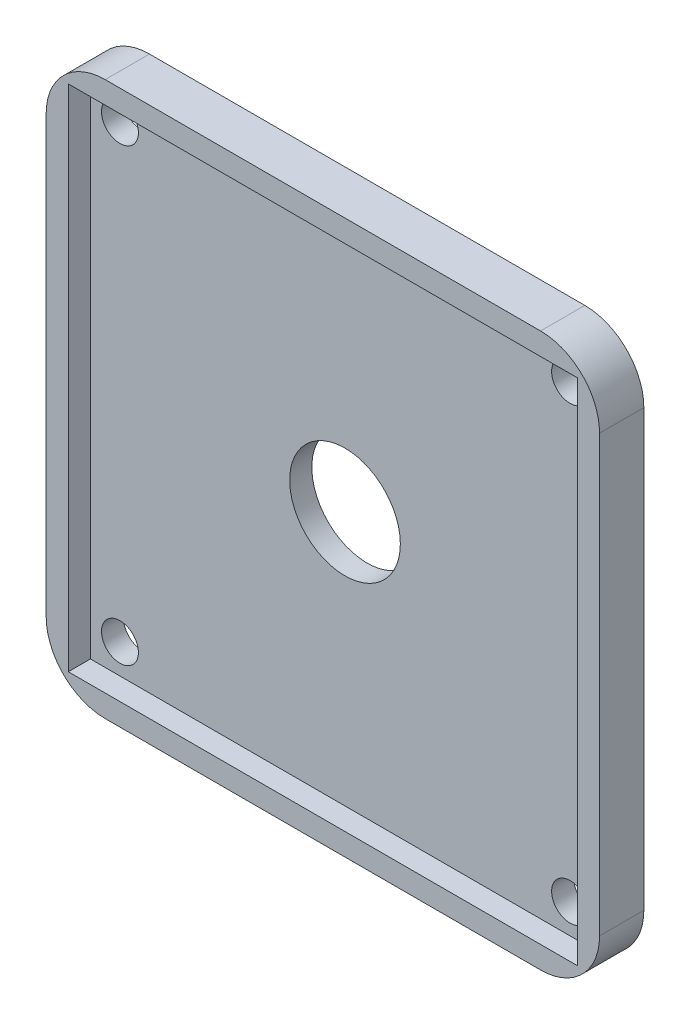
ISO-10303-21;
HEADER;
FILE_DESCRIPTION(('STEP AP214'),'2;1');
FILE_NAME('part.step','',(''),(''),'','','');
FILE_SCHEMA(('AUTOMOTIVE_DESIGN { 1 0 10303 214 1 1 1 1 }'));
ENDSEC;
DATA;
#1=APPLICATION_CONTEXT('core data for automotive mechanical design processes');
#2=APPLICATION_PROTOCOL_DEFINITION('international standard','automotive_design',2000,#1);
#3=PRODUCT_CONTEXT('',#1,'mechanical');
#4=PRODUCT('Part','Part','',(#3));
#5=PRODUCT_RELATED_PRODUCT_CATEGORY('part','',(#4));
#6=PRODUCT_DEFINITION_FORMATION('','',#4);
#7=PRODUCT_DEFINITION_CONTEXT('part definition',#1,'design');
#8=PRODUCT_DEFINITION('design','',#6,#7);
#9=PRODUCT_DEFINITION_SHAPE('','',#8);
#10=(LENGTH_UNIT() NAMED_UNIT(*) SI_UNIT(.MILLI.,.METRE.));
#11=(NAMED_UNIT(*) PLANE_ANGLE_UNIT() SI_UNIT($,.RADIAN.));
#12=(NAMED_UNIT(*) SI_UNIT($,.STERADIAN.) SOLID_ANGLE_UNIT());
#13=UNCERTAINTY_MEASURE_WITH_UNIT(LENGTH_MEASURE(1.E-05),#10,'distance_accuracy_value','');
#14=(GEOMETRIC_REPRESENTATION_CONTEXT(3) GLOBAL_UNCERTAINTY_ASSIGNED_CONTEXT((#13)) GLOBAL_UNIT_ASSIGNED_CONTEXT((#10,
#11,#12)) REPRESENTATION_CONTEXT('',''));
#15=CARTESIAN_POINT('',(0.,0.,0.));
#16=DIRECTION('',(0.,0.,1.));
#17=DIRECTION('',(1.,0.,0.));
#18=AXIS2_PLACEMENT_3D('',#15,#16,#17);
#19=CARTESIAN_POINT('',(7.00000000000001,68.,6.));
#20=DIRECTION('',(0.,0.,-1.));
#21=DIRECTION('',(-1.,0.,0.));
#22=AXIS2_PLACEMENT_3D('',#19,#20,#21);
#23=CYLINDRICAL_SURFACE('',#22,2.5);
#24=CARTESIAN_POINT('',(7.00000000000001,68.,0.));
#25=DIRECTION('',(0.,0.,1.));
#26=DIRECTION('',(1.,0.,0.));
#27=AXIS2_PLACEMENT_3D('',#24,#25,#26);
#28=CIRCLE('',#27,2.5);
#29=CARTESIAN_POINT('',(9.50000000000001,68.,0.));
#30=VERTEX_POINT('',#29);
#31=EDGE_CURVE('E216',#30,#30,#28,.T.);
#32=ORIENTED_EDGE('',*,*,#31,.F.);
#33=EDGE_LOOP('',(#32));
#34=FACE_BOUND('',#33,.T.);
#35=CARTESIAN_POINT('',(7.00000000000001,68.,3.));
#36=DIRECTION('',(0.,0.,1.));
#37=DIRECTION('',(1.,0.,0.));
#38=AXIS2_PLACEMENT_3D('',#35,#36,#37);
#39=CIRCLE('',#38,2.5);
#40=CARTESIAN_POINT('',(9.50000000000001,68.,3.));
#41=VERTEX_POINT('',#40);
#42=EDGE_CURVE('E196',#41,#41,#39,.T.);
#43=ORIENTED_EDGE('',*,*,#42,.T.);
#44=EDGE_LOOP('',(#43));
#45=FACE_BOUND('',#44,.T.);
#46=ADVANCED_FACE('F38',(#34,#45),#23,.F.);
#47=CARTESIAN_POINT('',(68.,68.,6.));
#48=DIRECTION('',(0.,0.,-1.));
#49=DIRECTION('',(-1.,0.,0.));
#50=AXIS2_PLACEMENT_3D('',#47,#48,#49);
#51=CYLINDRICAL_SURFACE('',#50,2.50000000000001);
#52=CARTESIAN_POINT('',(68.,68.,0.));
#53=DIRECTION('',(0.,0.,1.));
#54=DIRECTION('',(-1.,0.,0.));
#55=AXIS2_PLACEMENT_3D('',#52,#53,#54);
#56=CIRCLE('',#55,2.50000000000001);
#57=CARTESIAN_POINT('',(65.5,68.,0.));
#58=VERTEX_POINT('',#57);
#59=EDGE_CURVE('E212',#58,#58,#56,.T.);
#60=ORIENTED_EDGE('',*,*,#59,.F.);
#61=EDGE_LOOP('',(#60));
#62=FACE_BOUND('',#61,.T.);
#63=CARTESIAN_POINT('',(68.,68.,3.));
#64=DIRECTION('',(0.,0.,1.));
#65=DIRECTION('',(1.,0.,0.));
#66=AXIS2_PLACEMENT_3D('',#63,#64,#65);
#67=CIRCLE('',#66,2.50000000000001);
#68=CARTESIAN_POINT('',(70.5,68.,3.));
#69=VERTEX_POINT('',#68);
#70=EDGE_CURVE('E192',#69,#69,#67,.T.);
#71=ORIENTED_EDGE('',*,*,#70,.T.);
#72=EDGE_LOOP('',(#71));
#73=FACE_BOUND('',#72,.T.);
#74=ADVANCED_FACE('F339',(#62,#73),#51,.F.);
#75=CARTESIAN_POINT('',(68.,7.00000000000001,6.));
#76=DIRECTION('',(0.,0.,-1.));
#77=DIRECTION('',(-1.,0.,0.));
#78=AXIS2_PLACEMENT_3D('',#75,#76,#77);
#79=CYLINDRICAL_SURFACE('',#78,2.50000000000001);
#80=CARTESIAN_POINT('',(68.,7.00000000000001,0.));
#81=DIRECTION('',(0.,0.,1.));
#82=DIRECTION('',(1.,0.,0.));
#83=AXIS2_PLACEMENT_3D('',#80,#81,#82);
#84=CIRCLE('',#83,2.50000000000001);
#85=CARTESIAN_POINT('',(70.5,7.00000000000001,0.));
#86=VERTEX_POINT('',#85);
#87=EDGE_CURVE('E208',#86,#86,#84,.T.);
#88=ORIENTED_EDGE('',*,*,#87,.F.);
#89=EDGE_LOOP('',(#88));
#90=FACE_BOUND('',#89,.T.);
#91=CARTESIAN_POINT('',(68.,7.00000000000001,3.));
#92=DIRECTION('',(0.,0.,1.));
#93=DIRECTION('',(1.,0.,0.));
#94=AXIS2_PLACEMENT_3D('',#91,#92,#93);
#95=CIRCLE('',#94,2.50000000000001);
#96=CARTESIAN_POINT('',(70.5,7.00000000000001,3.));
#97=VERTEX_POINT('',#96);
#98=EDGE_CURVE('E188',#97,#97,#95,.T.);
#99=ORIENTED_EDGE('',*,*,#98,.T.);
#100=EDGE_LOOP('',(#99));
#101=FACE_BOUND('',#100,.T.);
#102=ADVANCED_FACE('F345',(#90,#101),#79,.F.);
#103=CARTESIAN_POINT('',(7.00000000000001,7.00000000000001,6.));
#104=DIRECTION('',(0.,0.,-1.));
#105=DIRECTION('',(-1.,0.,0.));
#106=AXIS2_PLACEMENT_3D('',#103,#104,#105);
#107=CYLINDRICAL_SURFACE('',#106,2.5);
#108=CARTESIAN_POINT('',(7.00000000000001,7.00000000000001,0.));
#109=DIRECTION('',(0.,0.,1.));
#110=DIRECTION('',(-1.,0.,0.));
#111=AXIS2_PLACEMENT_3D('',#108,#109,#110);
#112=CIRCLE('',#111,2.5);
#113=CARTESIAN_POINT('',(4.50000000000001,7.00000000000001,0.));
#114=VERTEX_POINT('',#113);
#115=EDGE_CURVE('E204',#114,#114,#112,.T.);
#116=ORIENTED_EDGE('',*,*,#115,.F.);
#117=EDGE_LOOP('',(#116));
#118=FACE_BOUND('',#117,.T.);
#119=CARTESIAN_POINT('',(7.00000000000001,7.00000000000001,3.));
#120=DIRECTION('',(0.,0.,1.));
#121=DIRECTION('',(1.,0.,0.));
#122=AXIS2_PLACEMENT_3D('',#119,#120,#121);
#123=CIRCLE('',#122,2.5);
#124=CARTESIAN_POINT('',(9.50000000000001,7.00000000000001,3.));
#125=VERTEX_POINT('',#124);
#126=EDGE_CURVE('E184',#125,#125,#123,.T.);
#127=ORIENTED_EDGE('',*,*,#126,.T.);
#128=EDGE_LOOP('',(#127));
#129=FACE_BOUND('',#128,.T.);
#130=ADVANCED_FACE('F450',(#118,#129),#107,.F.);
#131=CARTESIAN_POINT('',(37.5,37.5,6.));
#132=DIRECTION('',(0.,0.,-1.));
#133=DIRECTION('',(-1.,0.,0.));
#134=AXIS2_PLACEMENT_3D('',#131,#132,#133);
#135=CYLINDRICAL_SURFACE('',#134,7.5);
#136=CARTESIAN_POINT('',(37.5,37.5,0.));
#137=DIRECTION('',(0.,0.,1.));
#138=DIRECTION('',(1.,0.,0.));
#139=AXIS2_PLACEMENT_3D('',#136,#137,#138);
#140=CIRCLE('',#139,7.5);
#141=CARTESIAN_POINT('',(45.,37.5,0.));
#142=VERTEX_POINT('',#141);
#143=EDGE_CURVE('E200',#142,#142,#140,.T.);
#144=ORIENTED_EDGE('',*,*,#143,.F.);
#145=EDGE_LOOP('',(#144));
#146=FACE_BOUND('',#145,.T.);
#147=CARTESIAN_POINT('',(37.5,37.5,3.));
#148=DIRECTION('',(0.,0.,1.));
#149=DIRECTION('',(1.,0.,0.));
#150=AXIS2_PLACEMENT_3D('',#147,#148,#149);
#151=CIRCLE('',#150,7.5);
#152=CARTESIAN_POINT('',(45.,37.5,3.));
#153=VERTEX_POINT('',#152);
#154=EDGE_CURVE('E178',#153,#153,#151,.T.);
#155=ORIENTED_EDGE('',*,*,#154,.T.);
#156=EDGE_LOOP('',(#155));
#157=FACE_BOUND('',#156,.T.);
#158=ADVANCED_FACE('F354',(#146,#157),#135,.F.);
#159=CARTESIAN_POINT('',(0.,0.,6.));
#160=DIRECTION('',(0.,0.,-1.));
#161=DIRECTION('',(-1.,0.,0.));
#162=AXIS2_PLACEMENT_3D('',#159,#160,#161);
#163=PLANE('',#162);
#164=DIRECTION('',(1.,0.,0.));
#165=VECTOR('',#164,1.);
#166=CARTESIAN_POINT('',(3.00000000000001,3.,6.));
#167=LINE('',#166,#165);
#168=CARTESIAN_POINT('',(3.00000000000001,3.,6.));
#169=VERTEX_POINT('',#168);
#170=CARTESIAN_POINT('',(72.,3.,6.));
#171=VERTEX_POINT('',#170);
#172=EDGE_CURVE('E169',#169,#171,#167,.T.);
#173=ORIENTED_EDGE('',*,*,#172,.F.);
#174=DIRECTION('',(0.,-1.,0.));
#175=VECTOR('',#174,1.);
#176=CARTESIAN_POINT('',(3.,72.,6.));
#177=LINE('',#176,#175);
#178=CARTESIAN_POINT('',(3.,72.,6.));
#179=VERTEX_POINT('',#178);
#180=EDGE_CURVE('E136',#179,#169,#177,.T.);
#181=ORIENTED_EDGE('',*,*,#180,.F.);
#182=DIRECTION('',(-1.,0.,0.));
#183=VECTOR('',#182,1.);
#184=CARTESIAN_POINT('',(3.,72.,6.));
#185=LINE('',#184,#183);
#186=CARTESIAN_POINT('',(72.,72.,6.));
#187=VERTEX_POINT('',#186);
#188=EDGE_CURVE('E156',#187,#179,#185,.T.);
#189=ORIENTED_EDGE('',*,*,#188,.F.);
#190=DIRECTION('',(0.,1.,0.));
#191=VECTOR('',#190,1.);
#192=CARTESIAN_POINT('',(72.,72.,6.));
#193=LINE('',#192,#191);
#194=EDGE_CURVE('E160',#171,#187,#193,.T.);
#195=ORIENTED_EDGE('',*,*,#194,.F.);
#196=EDGE_LOOP('',(#173,#181,#189,#195));
#197=FACE_BOUND('',#196,.T.);
#198=DIRECTION('',(0.,-1.,0.));
#199=VECTOR('',#198,1.);
#200=CARTESIAN_POINT('',(0.,0.,6.));
#201=LINE('',#200,#199);
#202=CARTESIAN_POINT('',(0.,67.,6.));
#203=VERTEX_POINT('',#202);
#204=CARTESIAN_POINT('',(0.,8.,6.));
#205=VERTEX_POINT('',#204);
#206=EDGE_CURVE('E221',#203,#205,#201,.T.);
#207=ORIENTED_EDGE('',*,*,#206,.T.);
#208=CARTESIAN_POINT('',(8.,8.,6.));
#209=DIRECTION('',(0.,0.,-1.));
#210=DIRECTION('',(-1.,0.,0.));
#211=AXIS2_PLACEMENT_3D('',#208,#209,#210);
#212=CIRCLE('',#211,8.);
#213=CARTESIAN_POINT('',(8.,0.,6.));
#214=VERTEX_POINT('',#213);
#215=EDGE_CURVE('E286',#205,#214,#212,.F.);
#216=ORIENTED_EDGE('',*,*,#215,.T.);
#217=DIRECTION('',(1.,0.,0.));
#218=VECTOR('',#217,1.);
#219=CARTESIAN_POINT('',(0.,0.,6.));
#220=LINE('',#219,#218);
#221=CARTESIAN_POINT('',(67.,0.,6.));
#222=VERTEX_POINT('',#221);
#223=EDGE_CURVE('E225',#214,#222,#220,.T.);
#224=ORIENTED_EDGE('',*,*,#223,.T.);
#225=CARTESIAN_POINT('',(67.,8.,6.));
#226=DIRECTION('',(0.,0.,-1.));
#227=DIRECTION('',(-1.,0.,0.));
#228=AXIS2_PLACEMENT_3D('',#225,#226,#227);
#229=CIRCLE('',#228,8.);
#230=CARTESIAN_POINT('',(75.,8.,6.));
#231=VERTEX_POINT('',#230);
#232=EDGE_CURVE('E283',#222,#231,#229,.F.);
#233=ORIENTED_EDGE('',*,*,#232,.T.);
#234=DIRECTION('',(0.,1.,0.));
#235=VECTOR('',#234,1.);
#236=CARTESIAN_POINT('',(75.,0.,6.));
#237=LINE('',#236,#235);
#238=CARTESIAN_POINT('',(75.,67.,6.));
#239=VERTEX_POINT('',#238);
#240=EDGE_CURVE('E230',#231,#239,#237,.T.);
#241=ORIENTED_EDGE('',*,*,#240,.T.);
#242=CARTESIAN_POINT('',(67.,67.,6.));
#243=DIRECTION('',(0.,0.,-1.));
#244=DIRECTION('',(-1.,0.,0.));
#245=AXIS2_PLACEMENT_3D('',#242,#243,#244);
#246=CIRCLE('',#245,8.);
#247=CARTESIAN_POINT('',(67.,75.,6.));
#248=VERTEX_POINT('',#247);
#249=EDGE_CURVE('E60',#239,#248,#246,.F.);
#250=ORIENTED_EDGE('',*,*,#249,.T.);
#251=DIRECTION('',(-1.,0.,0.));
#252=VECTOR('',#251,1.);
#253=CARTESIAN_POINT('',(0.,75.,6.));
#254=LINE('',#253,#252);
#255=CARTESIAN_POINT('',(8.,75.,6.));
#256=VERTEX_POINT('',#255);
#257=EDGE_CURVE('E233',#248,#256,#254,.T.);
#258=ORIENTED_EDGE('',*,*,#257,.T.);
#259=CARTESIAN_POINT('',(8.,67.,6.));
#260=DIRECTION('',(0.,0.,-1.));
#261=DIRECTION('',(-1.,0.,0.));
#262=AXIS2_PLACEMENT_3D('',#259,#260,#261);
#263=CIRCLE('',#262,8.);
#264=EDGE_CURVE('E278',#256,#203,#263,.F.);
#265=ORIENTED_EDGE('',*,*,#264,.T.);
#266=EDGE_LOOP('',(#207,#216,#224,#233,#241,#250,#258,#265));
#267=FACE_BOUND('',#266,.T.);
#268=ADVANCED_FACE('F314',(#197,#267),#163,.F.);
#269=CARTESIAN_POINT('',(0.,0.,0.));
#270=DIRECTION('',(0.,0.,-1.));
#271=DIRECTION('',(-1.,0.,0.));
#272=AXIS2_PLACEMENT_3D('',#269,#270,#271);
#273=PLANE('',#272);
#274=ORIENTED_EDGE('',*,*,#115,.T.);
#275=EDGE_LOOP('',(#274));
#276=FACE_BOUND('',#275,.T.);
#277=ORIENTED_EDGE('',*,*,#59,.T.);
#278=EDGE_LOOP('',(#277));
#279=FACE_BOUND('',#278,.T.);
#280=DIRECTION('',(1.,0.,0.));
#281=VECTOR('',#280,1.);
#282=CARTESIAN_POINT('',(0.,0.,0.));
#283=LINE('',#282,#281);
#284=CARTESIAN_POINT('',(8.,0.,0.));
#285=VERTEX_POINT('',#284);
#286=CARTESIAN_POINT('',(67.,0.,0.));
#287=VERTEX_POINT('',#286);
#288=EDGE_CURVE('E240',#285,#287,#283,.T.);
#289=ORIENTED_EDGE('',*,*,#288,.F.);
#290=CARTESIAN_POINT('',(8.,8.,0.));
#291=DIRECTION('',(0.,0.,-1.));
#292=DIRECTION('',(-1.,0.,0.));
#293=AXIS2_PLACEMENT_3D('',#290,#291,#292);
#294=CIRCLE('',#293,8.);
#295=CARTESIAN_POINT('',(0.,8.,0.));
#296=VERTEX_POINT('',#295);
#297=EDGE_CURVE('E268',#285,#296,#294,.T.);
#298=ORIENTED_EDGE('',*,*,#297,.T.);
#299=DIRECTION('',(0.,-1.,0.));
#300=VECTOR('',#299,1.);
#301=CARTESIAN_POINT('',(0.,0.,0.));
#302=LINE('',#301,#300);
#303=CARTESIAN_POINT('',(0.,67.,0.));
#304=VERTEX_POINT('',#303);
#305=EDGE_CURVE('E220',#304,#296,#302,.T.);
#306=ORIENTED_EDGE('',*,*,#305,.F.);
#307=CARTESIAN_POINT('',(8.,67.,0.));
#308=DIRECTION('',(0.,0.,-1.));
#309=DIRECTION('',(-1.,0.,0.));
#310=AXIS2_PLACEMENT_3D('',#307,#308,#309);
#311=CIRCLE('',#310,8.);
#312=CARTESIAN_POINT('',(8.,75.,0.));
#313=VERTEX_POINT('',#312);
#314=EDGE_CURVE('E259',#304,#313,#311,.T.);
#315=ORIENTED_EDGE('',*,*,#314,.T.);
#316=DIRECTION('',(-1.,0.,0.));
#317=VECTOR('',#316,1.);
#318=CARTESIAN_POINT('',(0.,75.,0.));
#319=LINE('',#318,#317);
#320=CARTESIAN_POINT('',(67.,75.,0.));
#321=VERTEX_POINT('',#320);
#322=EDGE_CURVE('E226',#321,#313,#319,.T.);
#323=ORIENTED_EDGE('',*,*,#322,.F.);
#324=CARTESIAN_POINT('',(67.,67.,0.));
#325=DIRECTION('',(0.,0.,-1.));
#326=DIRECTION('',(-1.,0.,0.));
#327=AXIS2_PLACEMENT_3D('',#324,#325,#326);
#328=CIRCLE('',#327,8.);
#329=CARTESIAN_POINT('',(75.,67.,0.));
#330=VERTEX_POINT('',#329);
#331=EDGE_CURVE('E262',#321,#330,#328,.T.);
#332=ORIENTED_EDGE('',*,*,#331,.T.);
#333=DIRECTION('',(0.,1.,0.));
#334=VECTOR('',#333,1.);
#335=CARTESIAN_POINT('',(75.,0.,0.));
#336=LINE('',#335,#334);
#337=CARTESIAN_POINT('',(75.,8.,0.));
#338=VERTEX_POINT('',#337);
#339=EDGE_CURVE('E244',#338,#330,#336,.T.);
#340=ORIENTED_EDGE('',*,*,#339,.F.);
#341=CARTESIAN_POINT('',(67.,8.,0.));
#342=DIRECTION('',(0.,0.,-1.));
#343=DIRECTION('',(-1.,0.,0.));
#344=AXIS2_PLACEMENT_3D('',#341,#342,#343);
#345=CIRCLE('',#344,8.);
#346=EDGE_CURVE('E265',#338,#287,#345,.T.);
#347=ORIENTED_EDGE('',*,*,#346,.T.);
#348=EDGE_LOOP('',(#289,#298,#306,#315,#323,#332,#340,#347));
#349=FACE_BOUND('',#348,.T.);
#350=ORIENTED_EDGE('',*,*,#31,.T.);
#351=EDGE_LOOP('',(#350));
#352=FACE_BOUND('',#351,.T.);
#353=ORIENTED_EDGE('',*,*,#87,.T.);
#354=EDGE_LOOP('',(#353));
#355=FACE_BOUND('',#354,.T.);
#356=ORIENTED_EDGE('',*,*,#143,.T.);
#357=EDGE_LOOP('',(#356));
#358=FACE_BOUND('',#357,.T.);
#359=ADVANCED_FACE('F306',(#276,#279,#349,#352,#355,#358),#273,.T.);
#360=CARTESIAN_POINT('',(0.,0.,6.));
#361=DIRECTION('',(1.,0.,0.));
#362=DIRECTION('',(0.,0.,-1.));
#363=AXIS2_PLACEMENT_3D('',#360,#361,#362);
#364=PLANE('',#363);
#365=ORIENTED_EDGE('',*,*,#305,.T.);
#366=DIRECTION('',(0.,0.,-1.));
#367=VECTOR('',#366,1.);
#368=CARTESIAN_POINT('',(0.,8.,6.));
#369=LINE('',#368,#367);
#370=EDGE_CURVE('E275',#296,#205,#369,.F.);
#371=ORIENTED_EDGE('',*,*,#370,.T.);
#372=ORIENTED_EDGE('',*,*,#206,.F.);
#373=DIRECTION('',(0.,0.,-1.));
#374=VECTOR('',#373,1.);
#375=CARTESIAN_POINT('',(0.,67.,6.));
#376=LINE('',#375,#374);
#377=EDGE_CURVE('E271',#203,#304,#376,.T.);
#378=ORIENTED_EDGE('',*,*,#377,.T.);
#379=EDGE_LOOP('',(#365,#371,#372,#378));
#380=FACE_BOUND('',#379,.T.);
#381=ADVANCED_FACE('F320',(#380),#364,.F.);
#382=CARTESIAN_POINT('',(0.,0.,6.));
#383=DIRECTION('',(0.,1.,0.));
#384=DIRECTION('',(0.,0.,1.));
#385=AXIS2_PLACEMENT_3D('',#382,#383,#384);
#386=PLANE('',#385);
#387=ORIENTED_EDGE('',*,*,#223,.F.);
#388=DIRECTION('',(0.,0.,-1.));
#389=VECTOR('',#388,1.);
#390=CARTESIAN_POINT('',(8.,0.,6.));
#391=LINE('',#390,#389);
#392=EDGE_CURVE('E255',#214,#285,#391,.T.);
#393=ORIENTED_EDGE('',*,*,#392,.T.);
#394=ORIENTED_EDGE('',*,*,#288,.T.);
#395=DIRECTION('',(0.,0.,-1.));
#396=VECTOR('',#395,1.);
#397=CARTESIAN_POINT('',(67.,0.,6.));
#398=LINE('',#397,#396);
#399=EDGE_CURVE('E236',#287,#222,#398,.F.);
#400=ORIENTED_EDGE('',*,*,#399,.T.);
#401=EDGE_LOOP('',(#387,#393,#394,#400));
#402=FACE_BOUND('',#401,.T.);
#403=ADVANCED_FACE('F328',(#402),#386,.F.);
#404=CARTESIAN_POINT('',(75.,0.,6.));
#405=DIRECTION('',(-1.,0.,0.));
#406=DIRECTION('',(0.,0.,1.));
#407=AXIS2_PLACEMENT_3D('',#404,#405,#406);
#408=PLANE('',#407);
#409=ORIENTED_EDGE('',*,*,#240,.F.);
#410=DIRECTION('',(0.,0.,-1.));
#411=VECTOR('',#410,1.);
#412=CARTESIAN_POINT('',(75.,8.,6.));
#413=LINE('',#412,#411);
#414=EDGE_CURVE('E292',#231,#338,#413,.T.);
#415=ORIENTED_EDGE('',*,*,#414,.T.);
#416=ORIENTED_EDGE('',*,*,#339,.T.);
#417=DIRECTION('',(0.,0.,-1.));
#418=VECTOR('',#417,1.);
#419=CARTESIAN_POINT('',(75.,67.,6.));
#420=LINE('',#419,#418);
#421=EDGE_CURVE('E289',#330,#239,#420,.F.);
#422=ORIENTED_EDGE('',*,*,#421,.T.);
#423=EDGE_LOOP('',(#409,#415,#416,#422));
#424=FACE_BOUND('',#423,.T.);
#425=ADVANCED_FACE('F300',(#424),#408,.F.);
#426=CARTESIAN_POINT('',(0.,75.,6.));
#427=DIRECTION('',(0.,-1.,0.));
#428=DIRECTION('',(0.,0.,-1.));
#429=AXIS2_PLACEMENT_3D('',#426,#427,#428);
#430=PLANE('',#429);
#431=ORIENTED_EDGE('',*,*,#257,.F.);
#432=DIRECTION('',(0.,0.,-1.));
#433=VECTOR('',#432,1.);
#434=CARTESIAN_POINT('',(67.,75.,6.));
#435=LINE('',#434,#433);
#436=EDGE_CURVE('E11',#248,#321,#435,.T.);
#437=ORIENTED_EDGE('',*,*,#436,.T.);
#438=ORIENTED_EDGE('',*,*,#322,.T.);
#439=DIRECTION('',(0.,0.,-1.));
#440=VECTOR('',#439,1.);
#441=CARTESIAN_POINT('',(8.,75.,6.));
#442=LINE('',#441,#440);
#443=EDGE_CURVE('E47',#313,#256,#442,.F.);
#444=ORIENTED_EDGE('',*,*,#443,.T.);
#445=EDGE_LOOP('',(#431,#437,#438,#444));
#446=FACE_BOUND('',#445,.T.);
#447=ADVANCED_FACE('F312',(#446),#430,.F.);
#448=CARTESIAN_POINT('',(3.,72.,3.));
#449=DIRECTION('',(-1.,0.,0.));
#450=DIRECTION('',(0.,-1.,0.));
#451=AXIS2_PLACEMENT_3D('',#448,#449,#450);
#452=PLANE('',#451);
#453=ORIENTED_EDGE('',*,*,#180,.T.);
#454=DIRECTION('',(0.,0.,1.));
#455=VECTOR('',#454,1.);
#456=CARTESIAN_POINT('',(3.00000000000001,3.,3.));
#457=LINE('',#456,#455);
#458=CARTESIAN_POINT('',(3.00000000000001,3.,3.));
#459=VERTEX_POINT('',#458);
#460=EDGE_CURVE('E129',#459,#169,#457,.T.);
#461=ORIENTED_EDGE('',*,*,#460,.F.);
#462=DIRECTION('',(0.,-1.,0.));
#463=VECTOR('',#462,1.);
#464=CARTESIAN_POINT('',(3.,72.,3.));
#465=LINE('',#464,#463);
#466=CARTESIAN_POINT('',(3.,72.,3.));
#467=VERTEX_POINT('',#466);
#468=EDGE_CURVE('E133',#467,#459,#465,.T.);
#469=ORIENTED_EDGE('',*,*,#468,.F.);
#470=DIRECTION('',(0.,0.,1.));
#471=VECTOR('',#470,1.);
#472=CARTESIAN_POINT('',(3.,72.,3.));
#473=LINE('',#472,#471);
#474=EDGE_CURVE('E175',#467,#179,#473,.T.);
#475=ORIENTED_EDGE('',*,*,#474,.T.);
#476=EDGE_LOOP('',(#453,#461,#469,#475));
#477=FACE_BOUND('',#476,.T.);
#478=ADVANCED_FACE('F131',(#477),#452,.F.);
#479=CARTESIAN_POINT('',(3.,72.,3.));
#480=DIRECTION('',(0.,1.,0.));
#481=DIRECTION('',(0.,0.,1.));
#482=AXIS2_PLACEMENT_3D('',#479,#480,#481);
#483=PLANE('',#482);
#484=ORIENTED_EDGE('',*,*,#188,.T.);
#485=ORIENTED_EDGE('',*,*,#474,.F.);
#486=DIRECTION('',(-1.,0.,0.));
#487=VECTOR('',#486,1.);
#488=CARTESIAN_POINT('',(3.,72.,3.));
#489=LINE('',#488,#487);
#490=CARTESIAN_POINT('',(72.,72.,3.));
#491=VERTEX_POINT('',#490);
#492=EDGE_CURVE('E142',#491,#467,#489,.T.);
#493=ORIENTED_EDGE('',*,*,#492,.F.);
#494=DIRECTION('',(0.,0.,1.));
#495=VECTOR('',#494,1.);
#496=CARTESIAN_POINT('',(72.,72.,3.));
#497=LINE('',#496,#495);
#498=EDGE_CURVE('E179',#491,#187,#497,.T.);
#499=ORIENTED_EDGE('',*,*,#498,.T.);
#500=EDGE_LOOP('',(#484,#485,#493,#499));
#501=FACE_BOUND('',#500,.T.);
#502=ADVANCED_FACE('F426',(#501),#483,.F.);
#503=CARTESIAN_POINT('',(72.,72.,3.));
#504=DIRECTION('',(1.,0.,0.));
#505=DIRECTION('',(0.,1.,0.));
#506=AXIS2_PLACEMENT_3D('',#503,#504,#505);
#507=PLANE('',#506);
#508=ORIENTED_EDGE('',*,*,#194,.T.);
#509=ORIENTED_EDGE('',*,*,#498,.F.);
#510=DIRECTION('',(0.,1.,0.));
#511=VECTOR('',#510,1.);
#512=CARTESIAN_POINT('',(72.,72.,3.));
#513=LINE('',#512,#511);
#514=CARTESIAN_POINT('',(72.,3.,3.));
#515=VERTEX_POINT('',#514);
#516=EDGE_CURVE('E151',#515,#491,#513,.T.);
#517=ORIENTED_EDGE('',*,*,#516,.F.);
#518=DIRECTION('',(0.,0.,1.));
#519=VECTOR('',#518,1.);
#520=CARTESIAN_POINT('',(72.,3.,3.));
#521=LINE('',#520,#519);
#522=EDGE_CURVE('E141',#515,#171,#521,.T.);
#523=ORIENTED_EDGE('',*,*,#522,.T.);
#524=EDGE_LOOP('',(#508,#509,#517,#523));
#525=FACE_BOUND('',#524,.T.);
#526=ADVANCED_FACE('F419',(#525),#507,.F.);
#527=CARTESIAN_POINT('',(3.00000000000001,3.,3.));
#528=DIRECTION('',(0.,-1.,0.));
#529=DIRECTION('',(0.,0.,-1.));
#530=AXIS2_PLACEMENT_3D('',#527,#528,#529);
#531=PLANE('',#530);
#532=ORIENTED_EDGE('',*,*,#172,.T.);
#533=ORIENTED_EDGE('',*,*,#522,.F.);
#534=DIRECTION('',(1.,0.,0.));
#535=VECTOR('',#534,1.);
#536=CARTESIAN_POINT('',(3.00000000000001,3.,3.));
#537=LINE('',#536,#535);
#538=EDGE_CURVE('E145',#459,#515,#537,.T.);
#539=ORIENTED_EDGE('',*,*,#538,.F.);
#540=ORIENTED_EDGE('',*,*,#460,.T.);
#541=EDGE_LOOP('',(#532,#533,#539,#540));
#542=FACE_BOUND('',#541,.T.);
#543=ADVANCED_FACE('F146',(#542),#531,.F.);
#544=CARTESIAN_POINT('',(0.,0.,3.));
#545=DIRECTION('',(0.,0.,1.));
#546=DIRECTION('',(1.,0.,0.));
#547=AXIS2_PLACEMENT_3D('',#544,#545,#546);
#548=PLANE('',#547);
#549=ORIENTED_EDGE('',*,*,#42,.F.);
#550=EDGE_LOOP('',(#549));
#551=FACE_BOUND('',#550,.T.);
#552=ORIENTED_EDGE('',*,*,#70,.F.);
#553=EDGE_LOOP('',(#552));
#554=FACE_BOUND('',#553,.T.);
#555=ORIENTED_EDGE('',*,*,#98,.F.);
#556=EDGE_LOOP('',(#555));
#557=FACE_BOUND('',#556,.T.);
#558=ORIENTED_EDGE('',*,*,#126,.F.);
#559=EDGE_LOOP('',(#558));
#560=FACE_BOUND('',#559,.T.);
#561=ORIENTED_EDGE('',*,*,#154,.F.);
#562=EDGE_LOOP('',(#561));
#563=FACE_BOUND('',#562,.T.);
#564=ORIENTED_EDGE('',*,*,#468,.T.);
#565=ORIENTED_EDGE('',*,*,#538,.T.);
#566=ORIENTED_EDGE('',*,*,#516,.T.);
#567=ORIENTED_EDGE('',*,*,#492,.T.);
#568=EDGE_LOOP('',(#564,#565,#566,#567));
#569=FACE_BOUND('',#568,.T.);
#570=ADVANCED_FACE('F153',(#551,#554,#557,#560,#563,#569),#548,.T.);
#571=CARTESIAN_POINT('',(8.,8.,6.));
#572=DIRECTION('',(0.,0.,-1.));
#573=DIRECTION('',(-1.,0.,0.));
#574=AXIS2_PLACEMENT_3D('',#571,#572,#573);
#575=CYLINDRICAL_SURFACE('',#574,8.);
#576=ORIENTED_EDGE('',*,*,#215,.F.);
#577=ORIENTED_EDGE('',*,*,#370,.F.);
#578=ORIENTED_EDGE('',*,*,#297,.F.);
#579=ORIENTED_EDGE('',*,*,#392,.F.);
#580=EDGE_LOOP('',(#576,#577,#578,#579));
#581=FACE_BOUND('',#580,.T.);
#582=ADVANCED_FACE('F325',(#581),#575,.T.);
#583=CARTESIAN_POINT('',(67.,8.,6.));
#584=DIRECTION('',(0.,0.,-1.));
#585=DIRECTION('',(-1.,0.,0.));
#586=AXIS2_PLACEMENT_3D('',#583,#584,#585);
#587=CYLINDRICAL_SURFACE('',#586,8.);
#588=ORIENTED_EDGE('',*,*,#232,.F.);
#589=ORIENTED_EDGE('',*,*,#399,.F.);
#590=ORIENTED_EDGE('',*,*,#346,.F.);
#591=ORIENTED_EDGE('',*,*,#414,.F.);
#592=EDGE_LOOP('',(#588,#589,#590,#591));
#593=FACE_BOUND('',#592,.T.);
#594=ADVANCED_FACE('F330',(#593),#587,.T.);
#595=CARTESIAN_POINT('',(67.,67.,6.));
#596=DIRECTION('',(0.,0.,-1.));
#597=DIRECTION('',(-1.,0.,0.));
#598=AXIS2_PLACEMENT_3D('',#595,#596,#597);
#599=CYLINDRICAL_SURFACE('',#598,8.);
#600=ORIENTED_EDGE('',*,*,#249,.F.);
#601=ORIENTED_EDGE('',*,*,#421,.F.);
#602=ORIENTED_EDGE('',*,*,#331,.F.);
#603=ORIENTED_EDGE('',*,*,#436,.F.);
#604=EDGE_LOOP('',(#600,#601,#602,#603));
#605=FACE_BOUND('',#604,.T.);
#606=ADVANCED_FACE('F311',(#605),#599,.T.);
#607=CARTESIAN_POINT('',(8.,67.,6.));
#608=DIRECTION('',(0.,0.,-1.));
#609=DIRECTION('',(-1.,0.,0.));
#610=AXIS2_PLACEMENT_3D('',#607,#608,#609);
#611=CYLINDRICAL_SURFACE('',#610,8.);
#612=ORIENTED_EDGE('',*,*,#264,.F.);
#613=ORIENTED_EDGE('',*,*,#443,.F.);
#614=ORIENTED_EDGE('',*,*,#314,.F.);
#615=ORIENTED_EDGE('',*,*,#377,.F.);
#616=EDGE_LOOP('',(#612,#613,#614,#615));
#617=FACE_BOUND('',#616,.T.);
#618=ADVANCED_FACE('F40',(#617),#611,.T.);
#619=CLOSED_SHELL('',(#46,#74,#102,#130,#158,#268,#359,#381,#403,#425,#447,#478,#502,#526,#543,
#570,#582,#594,#606,#618));
#620=MANIFOLD_SOLID_BREP('B2',#619);
#621=ADVANCED_BREP_SHAPE_REPRESENTATION('',(#18,#620),#14);
#622=SHAPE_DEFINITION_REPRESENTATION(#9,#621);
ENDSEC;
END-ISO-10303-21;
